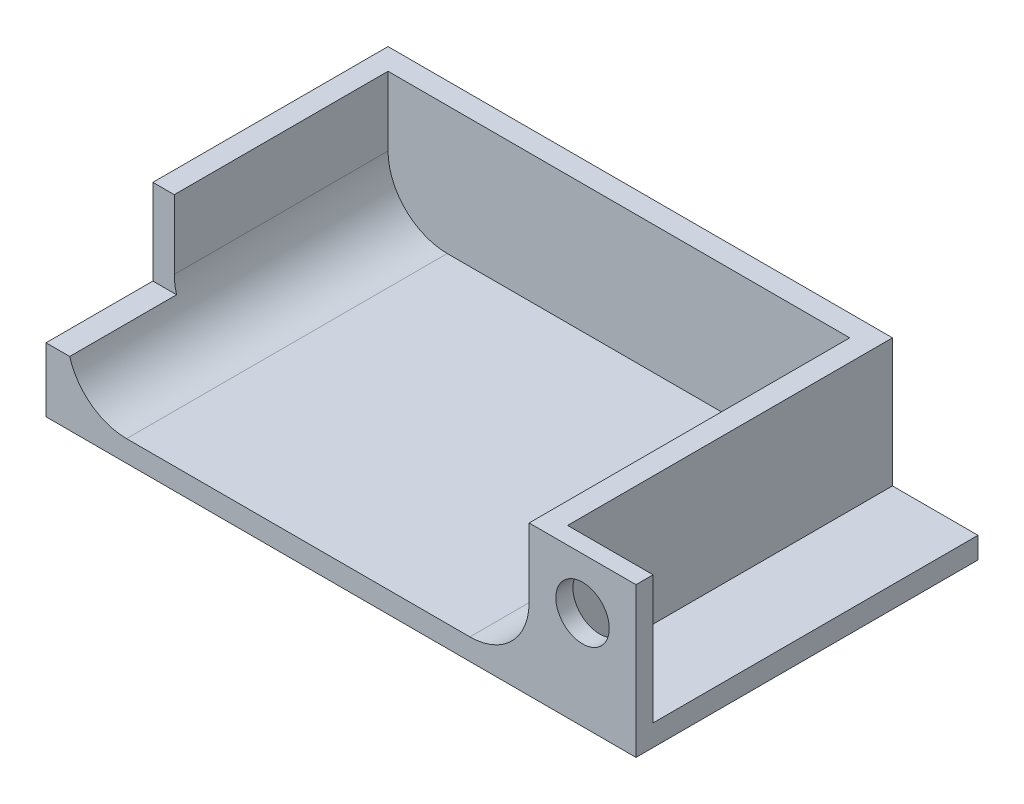
ISO-10303-21;
HEADER;
FILE_DESCRIPTION(('STEP AP214'),'2;1');
FILE_NAME('part.step','',(''),(''),'','','');
FILE_SCHEMA(('AUTOMOTIVE_DESIGN { 1 0 10303 214 1 1 1 1 }'));
ENDSEC;
DATA;
#1=APPLICATION_CONTEXT('core data for automotive mechanical design processes');
#2=APPLICATION_PROTOCOL_DEFINITION('international standard','automotive_design',2000,#1);
#3=PRODUCT_CONTEXT('',#1,'mechanical');
#4=PRODUCT('Part','Part','',(#3));
#5=PRODUCT_RELATED_PRODUCT_CATEGORY('part','',(#4));
#6=PRODUCT_DEFINITION_FORMATION('','',#4);
#7=PRODUCT_DEFINITION_CONTEXT('part definition',#1,'design');
#8=PRODUCT_DEFINITION('design','',#6,#7);
#9=PRODUCT_DEFINITION_SHAPE('','',#8);
#10=(LENGTH_UNIT() NAMED_UNIT(*) SI_UNIT(.MILLI.,.METRE.));
#11=(NAMED_UNIT(*) PLANE_ANGLE_UNIT() SI_UNIT($,.RADIAN.));
#12=(NAMED_UNIT(*) SI_UNIT($,.STERADIAN.) SOLID_ANGLE_UNIT());
#13=UNCERTAINTY_MEASURE_WITH_UNIT(LENGTH_MEASURE(1.E-05),#10,'distance_accuracy_value','');
#14=(GEOMETRIC_REPRESENTATION_CONTEXT(3) GLOBAL_UNCERTAINTY_ASSIGNED_CONTEXT((#13)) GLOBAL_UNIT_ASSIGNED_CONTEXT((#10,
#11,#12)) REPRESENTATION_CONTEXT('',''));
#15=CARTESIAN_POINT('',(0.,0.,0.));
#16=DIRECTION('',(0.,0.,1.));
#17=DIRECTION('',(1.,0.,0.));
#18=AXIS2_PLACEMENT_3D('',#15,#16,#17);
#19=CARTESIAN_POINT('',(0.,5.,0.));
#20=DIRECTION('',(0.,-1.,0.));
#21=DIRECTION('',(0.,0.,-1.));
#22=AXIS2_PLACEMENT_3D('',#19,#20,#21);
#23=PLANE('',#22);
#24=DIRECTION('',(1.,0.,0.));
#25=VECTOR('',#24,1.);
#26=CARTESIAN_POINT('',(0.,5.,0.));
#27=LINE('',#26,#25);
#28=CARTESIAN_POINT('',(18.85,5.,0.));
#29=VERTEX_POINT('',#28);
#30=CARTESIAN_POINT('',(99.15,5.,0.));
#31=VERTEX_POINT('',#30);
#32=EDGE_CURVE('E244',#29,#31,#27,.T.);
#33=ORIENTED_EDGE('',*,*,#32,.T.);
#34=DIRECTION('',(0.,0.,1.));
#35=VECTOR('',#34,1.);
#36=CARTESIAN_POINT('',(99.15,5.,-75.));
#37=LINE('',#36,#35);
#38=CARTESIAN_POINT('',(99.15,5.,-75.));
#39=VERTEX_POINT('',#38);
#40=EDGE_CURVE('E276',#31,#39,#37,.F.);
#41=ORIENTED_EDGE('',*,*,#40,.T.);
#42=DIRECTION('',(-1.,0.,0.));
#43=VECTOR('',#42,1.);
#44=CARTESIAN_POINT('',(0.,5.,-75.));
#45=LINE('',#44,#43);
#46=CARTESIAN_POINT('',(18.85,5.,-75.));
#47=VERTEX_POINT('',#46);
#48=EDGE_CURVE('E248',#39,#47,#45,.T.);
#49=ORIENTED_EDGE('',*,*,#48,.T.);
#50=DIRECTION('',(0.,0.,-1.));
#51=VECTOR('',#50,1.);
#52=CARTESIAN_POINT('',(18.85,5.,0.));
#53=LINE('',#52,#51);
#54=EDGE_CURVE('E273',#47,#29,#53,.F.);
#55=ORIENTED_EDGE('',*,*,#54,.T.);
#56=EDGE_LOOP('',(#33,#41,#49,#55));
#57=FACE_BOUND('',#56,.T.);
#58=ADVANCED_FACE('F38',(#57),#23,.F.);
#59=CARTESIAN_POINT('',(0.,5.,0.));
#60=DIRECTION('',(1.,0.,0.));
#61=DIRECTION('',(0.,0.,-1.));
#62=AXIS2_PLACEMENT_3D('',#59,#60,#61);
#63=PLANE('',#62);
#64=DIRECTION('',(0.,-1.,0.));
#65=VECTOR('',#64,1.);
#66=CARTESIAN_POINT('',(0.,5.,0.));
#67=LINE('',#66,#65);
#68=CARTESIAN_POINT('',(0.,15.,0.));
#69=VERTEX_POINT('',#68);
#70=CARTESIAN_POINT('',(0.,0.,0.));
#71=VERTEX_POINT('',#70);
#72=EDGE_CURVE('E266',#69,#71,#67,.T.);
#73=ORIENTED_EDGE('',*,*,#72,.F.);
#74=DIRECTION('',(0.,0.,1.));
#75=VECTOR('',#74,1.);
#76=CARTESIAN_POINT('',(0.,15.,0.));
#77=LINE('',#76,#75);
#78=CARTESIAN_POINT('',(0.,15.,-25.));
#79=VERTEX_POINT('',#78);
#80=EDGE_CURVE('E181',#79,#69,#77,.T.);
#81=ORIENTED_EDGE('',*,*,#80,.F.);
#82=DIRECTION('',(0.,-1.,0.));
#83=VECTOR('',#82,1.);
#84=CARTESIAN_POINT('',(0.,35.,-25.));
#85=LINE('',#84,#83);
#86=CARTESIAN_POINT('',(0.,35.,-25.));
#87=VERTEX_POINT('',#86);
#88=EDGE_CURVE('E178',#87,#79,#85,.T.);
#89=ORIENTED_EDGE('',*,*,#88,.F.);
#90=DIRECTION('',(0.,0.,1.));
#91=VECTOR('',#90,1.);
#92=CARTESIAN_POINT('',(0.,35.,-75.));
#93=LINE('',#92,#91);
#94=CARTESIAN_POINT('',(0.,35.,-80.));
#95=VERTEX_POINT('',#94);
#96=EDGE_CURVE('E232',#95,#87,#93,.T.);
#97=ORIENTED_EDGE('',*,*,#96,.F.);
#98=DIRECTION('',(0.,1.,0.));
#99=VECTOR('',#98,1.);
#100=CARTESIAN_POINT('',(0.,0.,-80.));
#101=LINE('',#100,#99);
#102=CARTESIAN_POINT('',(0.,0.,-80.));
#103=VERTEX_POINT('',#102);
#104=EDGE_CURVE('E205',#103,#95,#101,.T.);
#105=ORIENTED_EDGE('',*,*,#104,.F.);
#106=DIRECTION('',(0.,0.,1.));
#107=VECTOR('',#106,1.);
#108=CARTESIAN_POINT('',(0.,0.,0.));
#109=LINE('',#108,#107);
#110=EDGE_CURVE('E243',#103,#71,#109,.T.);
#111=ORIENTED_EDGE('',*,*,#110,.T.);
#112=EDGE_LOOP('',(#73,#81,#89,#97,#105,#111));
#113=FACE_BOUND('',#112,.T.);
#114=ADVANCED_FACE('F333',(#113),#63,.F.);
#115=CARTESIAN_POINT('',(0.,5.,0.));
#116=DIRECTION('',(0.,0.,-1.));
#117=DIRECTION('',(-1.,0.,0.));
#118=AXIS2_PLACEMENT_3D('',#115,#116,#117);
#119=PLANE('',#118);
#120=CARTESIAN_POINT('',(125.5,23.,0.));
#121=DIRECTION('',(0.,0.,1.));
#122=DIRECTION('',(1.,0.,0.));
#123=AXIS2_PLACEMENT_3D('',#120,#121,#122);
#124=CIRCLE('',#123,6.25);
#125=CARTESIAN_POINT('',(131.75,23.,0.));
#126=VERTEX_POINT('',#125);
#127=EDGE_CURVE('E460',#126,#126,#124,.T.);
#128=ORIENTED_EDGE('',*,*,#127,.F.);
#129=EDGE_LOOP('',(#128));
#130=FACE_BOUND('',#129,.T.);
#131=CARTESIAN_POINT('',(18.85,18.85,0.));
#132=DIRECTION('',(0.,0.,-1.));
#133=DIRECTION('',(-1.,0.,0.));
#134=AXIS2_PLACEMENT_3D('',#131,#132,#133);
#135=CIRCLE('',#134,13.85);
#136=CARTESIAN_POINT('',(5.54586530434994,15.,0.));
#137=VERTEX_POINT('',#136);
#138=EDGE_CURVE('E292',#29,#137,#135,.T.);
#139=ORIENTED_EDGE('',*,*,#138,.T.);
#140=DIRECTION('',(-1.,0.,0.));
#141=VECTOR('',#140,1.);
#142=CARTESIAN_POINT('',(6.,15.,0.));
#143=LINE('',#142,#141);
#144=EDGE_CURVE('E185',#137,#69,#143,.T.);
#145=ORIENTED_EDGE('',*,*,#144,.T.);
#146=ORIENTED_EDGE('',*,*,#72,.T.);
#147=DIRECTION('',(1.,0.,0.));
#148=VECTOR('',#147,1.);
#149=CARTESIAN_POINT('',(0.,0.,0.));
#150=LINE('',#149,#148);
#151=CARTESIAN_POINT('',(138.,0.,0.));
#152=VERTEX_POINT('',#151);
#153=EDGE_CURVE('E257',#71,#152,#150,.T.);
#154=ORIENTED_EDGE('',*,*,#153,.T.);
#155=DIRECTION('',(0.,-1.,0.));
#156=VECTOR('',#155,1.);
#157=CARTESIAN_POINT('',(138.,5.,0.));
#158=LINE('',#157,#156);
#159=CARTESIAN_POINT('',(138.,35.,0.));
#160=VERTEX_POINT('',#159);
#161=EDGE_CURVE('E253',#160,#152,#158,.T.);
#162=ORIENTED_EDGE('',*,*,#161,.F.);
#163=DIRECTION('',(1.,0.,0.));
#164=VECTOR('',#163,1.);
#165=CARTESIAN_POINT('',(138.,35.,0.));
#166=LINE('',#165,#164);
#167=CARTESIAN_POINT('',(113.,35.,0.));
#168=VERTEX_POINT('',#167);
#169=EDGE_CURVE('E220',#168,#160,#166,.T.);
#170=ORIENTED_EDGE('',*,*,#169,.F.);
#171=DIRECTION('',(0.,-1.,0.));
#172=VECTOR('',#171,1.);
#173=CARTESIAN_POINT('',(113.,35.,0.));
#174=LINE('',#173,#172);
#175=CARTESIAN_POINT('',(113.,18.85,0.));
#176=VERTEX_POINT('',#175);
#177=EDGE_CURVE('E224',#168,#176,#174,.T.);
#178=ORIENTED_EDGE('',*,*,#177,.T.);
#179=CARTESIAN_POINT('',(99.15,18.85,0.));
#180=DIRECTION('',(0.,0.,-1.));
#181=DIRECTION('',(-1.,0.,0.));
#182=AXIS2_PLACEMENT_3D('',#179,#180,#181);
#183=CIRCLE('',#182,13.85);
#184=EDGE_CURVE('E283',#176,#31,#183,.T.);
#185=ORIENTED_EDGE('',*,*,#184,.T.);
#186=ORIENTED_EDGE('',*,*,#32,.F.);
#187=EDGE_LOOP('',(#139,#145,#146,#154,#162,#170,#178,#185,#186));
#188=FACE_BOUND('',#187,.T.);
#189=ADVANCED_FACE('F324',(#130,#188),#119,.F.);
#190=CARTESIAN_POINT('',(138.,5.,0.));
#191=DIRECTION('',(-1.,0.,0.));
#192=DIRECTION('',(0.,0.,1.));
#193=AXIS2_PLACEMENT_3D('',#190,#191,#192);
#194=PLANE('',#193);
#195=DIRECTION('',(0.,0.,-1.));
#196=VECTOR('',#195,1.);
#197=CARTESIAN_POINT('',(138.,5.,-80.));
#198=LINE('',#197,#196);
#199=CARTESIAN_POINT('',(138.,5.,-4.));
#200=VERTEX_POINT('',#199);
#201=CARTESIAN_POINT('',(138.,5.,-80.));
#202=VERTEX_POINT('',#201);
#203=EDGE_CURVE('E54',#200,#202,#198,.T.);
#204=ORIENTED_EDGE('',*,*,#203,.F.);
#205=DIRECTION('',(0.,1.,0.));
#206=VECTOR('',#205,1.);
#207=CARTESIAN_POINT('',(138.,5.,-4.));
#208=LINE('',#207,#206);
#209=CARTESIAN_POINT('',(138.,35.,-4.));
#210=VERTEX_POINT('',#209);
#211=EDGE_CURVE('E173',#200,#210,#208,.T.);
#212=ORIENTED_EDGE('',*,*,#211,.T.);
#213=DIRECTION('',(0.,0.,-1.));
#214=VECTOR('',#213,1.);
#215=CARTESIAN_POINT('',(138.,35.,-75.));
#216=LINE('',#215,#214);
#217=EDGE_CURVE('E210',#160,#210,#216,.T.);
#218=ORIENTED_EDGE('',*,*,#217,.F.);
#219=ORIENTED_EDGE('',*,*,#161,.T.);
#220=DIRECTION('',(0.,0.,-1.));
#221=VECTOR('',#220,1.);
#222=CARTESIAN_POINT('',(138.,0.,0.));
#223=LINE('',#222,#221);
#224=CARTESIAN_POINT('',(138.,0.,-80.));
#225=VERTEX_POINT('',#224);
#226=EDGE_CURVE('E249',#152,#225,#223,.T.);
#227=ORIENTED_EDGE('',*,*,#226,.T.);
#228=DIRECTION('',(0.,-1.,0.));
#229=VECTOR('',#228,1.);
#230=CARTESIAN_POINT('',(138.,0.,-80.));
#231=LINE('',#230,#229);
#232=EDGE_CURVE('E198',#202,#225,#231,.T.);
#233=ORIENTED_EDGE('',*,*,#232,.F.);
#234=EDGE_LOOP('',(#204,#212,#218,#219,#227,#233));
#235=FACE_BOUND('',#234,.T.);
#236=ADVANCED_FACE('F341',(#235),#194,.F.);
#237=CARTESIAN_POINT('',(0.,0.,0.));
#238=DIRECTION('',(0.,-1.,0.));
#239=DIRECTION('',(0.,0.,-1.));
#240=AXIS2_PLACEMENT_3D('',#237,#238,#239);
#241=PLANE('',#240);
#242=ORIENTED_EDGE('',*,*,#110,.F.);
#243=DIRECTION('',(-1.,0.,0.));
#244=VECTOR('',#243,1.);
#245=CARTESIAN_POINT('',(138.,0.,-80.));
#246=LINE('',#245,#244);
#247=EDGE_CURVE('E201',#225,#103,#246,.T.);
#248=ORIENTED_EDGE('',*,*,#247,.F.);
#249=ORIENTED_EDGE('',*,*,#226,.F.);
#250=ORIENTED_EDGE('',*,*,#153,.F.);
#251=EDGE_LOOP('',(#242,#248,#249,#250));
#252=FACE_BOUND('',#251,.T.);
#253=ADVANCED_FACE('F338',(#252),#241,.T.);
#254=CARTESIAN_POINT('',(5.,35.,-75.));
#255=DIRECTION('',(-1.,0.,0.));
#256=DIRECTION('',(0.,0.,1.));
#257=AXIS2_PLACEMENT_3D('',#254,#255,#256);
#258=PLANE('',#257);
#259=DIRECTION('',(0.,0.,-1.));
#260=VECTOR('',#259,1.);
#261=CARTESIAN_POINT('',(5.,35.,-75.));
#262=LINE('',#261,#260);
#263=CARTESIAN_POINT('',(5.00000000000001,35.,-25.));
#264=VERTEX_POINT('',#263);
#265=CARTESIAN_POINT('',(5.,35.,-75.));
#266=VERTEX_POINT('',#265);
#267=EDGE_CURVE('E236',#264,#266,#262,.T.);
#268=ORIENTED_EDGE('',*,*,#267,.F.);
#269=DIRECTION('',(0.,-1.,0.));
#270=VECTOR('',#269,1.);
#271=CARTESIAN_POINT('',(5.00000000000001,35.,-25.));
#272=LINE('',#271,#270);
#273=CARTESIAN_POINT('',(5.,18.85,-25.));
#274=VERTEX_POINT('',#273);
#275=EDGE_CURVE('E189',#264,#274,#272,.T.);
#276=ORIENTED_EDGE('',*,*,#275,.T.);
#277=DIRECTION('',(0.,0.,-1.));
#278=VECTOR('',#277,1.);
#279=CARTESIAN_POINT('',(5.,18.85,-75.));
#280=LINE('',#279,#278);
#281=CARTESIAN_POINT('',(5.,18.85,-75.));
#282=VERTEX_POINT('',#281);
#283=EDGE_CURVE('E280',#274,#282,#280,.T.);
#284=ORIENTED_EDGE('',*,*,#283,.T.);
#285=DIRECTION('',(0.,-1.,0.));
#286=VECTOR('',#285,1.);
#287=CARTESIAN_POINT('',(5.,35.,-75.));
#288=LINE('',#287,#286);
#289=EDGE_CURVE('E239',#266,#282,#288,.T.);
#290=ORIENTED_EDGE('',*,*,#289,.F.);
#291=EDGE_LOOP('',(#268,#276,#284,#290));
#292=FACE_BOUND('',#291,.T.);
#293=ADVANCED_FACE('F305',(#292),#258,.F.);
#294=CARTESIAN_POINT('',(0.,35.,0.));
#295=DIRECTION('',(0.,1.,0.));
#296=DIRECTION('',(0.,0.,1.));
#297=AXIS2_PLACEMENT_3D('',#294,#295,#296);
#298=PLANE('',#297);
#299=DIRECTION('',(1.,0.,0.));
#300=VECTOR('',#299,1.);
#301=CARTESIAN_POINT('',(138.,35.,-4.));
#302=LINE('',#301,#300);
#303=CARTESIAN_POINT('',(118.,35.,-4.));
#304=VERTEX_POINT('',#303);
#305=EDGE_CURVE('E344',#304,#210,#302,.T.);
#306=ORIENTED_EDGE('',*,*,#305,.F.);
#307=DIRECTION('',(0.,0.,1.));
#308=VECTOR('',#307,1.);
#309=CARTESIAN_POINT('',(118.,35.,-80.));
#310=LINE('',#309,#308);
#311=CARTESIAN_POINT('',(118.,35.,-80.));
#312=VERTEX_POINT('',#311);
#313=EDGE_CURVE('E345',#312,#304,#310,.T.);
#314=ORIENTED_EDGE('',*,*,#313,.F.);
#315=DIRECTION('',(1.,0.,0.));
#316=VECTOR('',#315,1.);
#317=CARTESIAN_POINT('',(138.,35.,-80.));
#318=LINE('',#317,#316);
#319=EDGE_CURVE('E168',#95,#312,#318,.T.);
#320=ORIENTED_EDGE('',*,*,#319,.F.);
#321=ORIENTED_EDGE('',*,*,#96,.T.);
#322=DIRECTION('',(-1.,0.,0.));
#323=VECTOR('',#322,1.);
#324=CARTESIAN_POINT('',(6.,35.,-25.));
#325=LINE('',#324,#323);
#326=EDGE_CURVE('E184',#264,#87,#325,.T.);
#327=ORIENTED_EDGE('',*,*,#326,.F.);
#328=ORIENTED_EDGE('',*,*,#267,.T.);
#329=DIRECTION('',(1.,0.,0.));
#330=VECTOR('',#329,1.);
#331=CARTESIAN_POINT('',(138.,35.,-75.));
#332=LINE('',#331,#330);
#333=CARTESIAN_POINT('',(113.,35.,-75.));
#334=VERTEX_POINT('',#333);
#335=EDGE_CURVE('E197',#266,#334,#332,.T.);
#336=ORIENTED_EDGE('',*,*,#335,.T.);
#337=DIRECTION('',(0.,0.,1.));
#338=VECTOR('',#337,1.);
#339=CARTESIAN_POINT('',(113.,35.,-75.));
#340=LINE('',#339,#338);
#341=EDGE_CURVE('E217',#334,#168,#340,.T.);
#342=ORIENTED_EDGE('',*,*,#341,.T.);
#343=ORIENTED_EDGE('',*,*,#169,.T.);
#344=ORIENTED_EDGE('',*,*,#217,.T.);
#345=EDGE_LOOP('',(#306,#314,#320,#321,#327,#328,#336,#342,#343,#344));
#346=FACE_BOUND('',#345,.T.);
#347=ADVANCED_FACE('F310',(#346),#298,.T.);
#348=CARTESIAN_POINT('',(113.,35.,-75.));
#349=DIRECTION('',(1.,0.,0.));
#350=DIRECTION('',(0.,0.,-1.));
#351=AXIS2_PLACEMENT_3D('',#348,#349,#350);
#352=PLANE('',#351);
#353=DIRECTION('',(0.,-1.,0.));
#354=VECTOR('',#353,1.);
#355=CARTESIAN_POINT('',(113.,35.,-75.));
#356=LINE('',#355,#354);
#357=CARTESIAN_POINT('',(113.,18.85,-75.));
#358=VERTEX_POINT('',#357);
#359=EDGE_CURVE('E228',#334,#358,#356,.T.);
#360=ORIENTED_EDGE('',*,*,#359,.T.);
#361=DIRECTION('',(0.,0.,1.));
#362=VECTOR('',#361,1.);
#363=CARTESIAN_POINT('',(113.,18.85,0.));
#364=LINE('',#363,#362);
#365=EDGE_CURVE('E269',#358,#176,#364,.T.);
#366=ORIENTED_EDGE('',*,*,#365,.T.);
#367=ORIENTED_EDGE('',*,*,#177,.F.);
#368=ORIENTED_EDGE('',*,*,#341,.F.);
#369=EDGE_LOOP('',(#360,#366,#367,#368));
#370=FACE_BOUND('',#369,.T.);
#371=ADVANCED_FACE('F317',(#370),#352,.F.);
#372=CARTESIAN_POINT('',(99.15,18.85,-75.));
#373=DIRECTION('',(0.,0.,-1.));
#374=DIRECTION('',(-1.,0.,0.));
#375=AXIS2_PLACEMENT_3D('',#372,#373,#374);
#376=CYLINDRICAL_SURFACE('',#375,13.85);
#377=CARTESIAN_POINT('',(99.15,18.85,-75.));
#378=DIRECTION('',(0.,0.,1.));
#379=DIRECTION('',(1.,0.,0.));
#380=AXIS2_PLACEMENT_3D('',#377,#378,#379);
#381=CIRCLE('',#380,13.85);
#382=EDGE_CURVE('E286',#39,#358,#381,.T.);
#383=ORIENTED_EDGE('',*,*,#382,.F.);
#384=ORIENTED_EDGE('',*,*,#40,.F.);
#385=ORIENTED_EDGE('',*,*,#184,.F.);
#386=ORIENTED_EDGE('',*,*,#365,.F.);
#387=EDGE_LOOP('',(#383,#384,#385,#386));
#388=FACE_BOUND('',#387,.T.);
#389=ADVANCED_FACE('F320',(#388),#376,.F.);
#390=CARTESIAN_POINT('',(18.85,18.85,-75.));
#391=DIRECTION('',(0.,0.,1.));
#392=DIRECTION('',(1.,0.,0.));
#393=AXIS2_PLACEMENT_3D('',#390,#391,#392);
#394=CYLINDRICAL_SURFACE('',#393,13.85);
#395=CARTESIAN_POINT('',(18.85,18.85,-25.));
#396=DIRECTION('',(0.,0.,-1.));
#397=DIRECTION('',(0.,1.,0.));
#398=AXIS2_PLACEMENT_3D('',#395,#396,#397);
#399=CIRCLE('',#398,13.85);
#400=CARTESIAN_POINT('',(5.54586530434994,15.,-25.));
#401=VERTEX_POINT('',#400);
#402=EDGE_CURVE('E47',#274,#401,#399,.F.);
#403=ORIENTED_EDGE('',*,*,#402,.T.);
#404=DIRECTION('',(0.,0.,1.));
#405=VECTOR('',#404,1.);
#406=CARTESIAN_POINT('',(5.54586530434993,15.,-75.));
#407=LINE('',#406,#405);
#408=EDGE_CURVE('E11',#401,#137,#407,.T.);
#409=ORIENTED_EDGE('',*,*,#408,.T.);
#410=ORIENTED_EDGE('',*,*,#138,.F.);
#411=ORIENTED_EDGE('',*,*,#54,.F.);
#412=CARTESIAN_POINT('',(18.85,18.85,-75.));
#413=DIRECTION('',(0.,0.,1.));
#414=DIRECTION('',(1.,0.,0.));
#415=AXIS2_PLACEMENT_3D('',#412,#413,#414);
#416=CIRCLE('',#415,13.85);
#417=EDGE_CURVE('E289',#282,#47,#416,.T.);
#418=ORIENTED_EDGE('',*,*,#417,.F.);
#419=ORIENTED_EDGE('',*,*,#283,.F.);
#420=EDGE_LOOP('',(#403,#409,#410,#411,#418,#419));
#421=FACE_BOUND('',#420,.T.);
#422=ADVANCED_FACE('F40',(#421),#394,.F.);
#423=CARTESIAN_POINT('',(0.,0.,-80.));
#424=DIRECTION('',(0.,0.,1.));
#425=DIRECTION('',(1.,0.,0.));
#426=AXIS2_PLACEMENT_3D('',#423,#424,#425);
#427=PLANE('',#426);
#428=ORIENTED_EDGE('',*,*,#319,.T.);
#429=DIRECTION('',(0.,1.,0.));
#430=VECTOR('',#429,1.);
#431=CARTESIAN_POINT('',(118.,5.,-80.));
#432=LINE('',#431,#430);
#433=CARTESIAN_POINT('',(118.,5.,-80.));
#434=VERTEX_POINT('',#433);
#435=EDGE_CURVE('E151',#434,#312,#432,.T.);
#436=ORIENTED_EDGE('',*,*,#435,.F.);
#437=DIRECTION('',(-1.,0.,0.));
#438=VECTOR('',#437,1.);
#439=CARTESIAN_POINT('',(138.,5.,-80.));
#440=LINE('',#439,#438);
#441=EDGE_CURVE('E157',#202,#434,#440,.T.);
#442=ORIENTED_EDGE('',*,*,#441,.F.);
#443=ORIENTED_EDGE('',*,*,#232,.T.);
#444=ORIENTED_EDGE('',*,*,#247,.T.);
#445=ORIENTED_EDGE('',*,*,#104,.T.);
#446=EDGE_LOOP('',(#428,#436,#442,#443,#444,#445));
#447=FACE_BOUND('',#446,.T.);
#448=ADVANCED_FACE('F165',(#447),#427,.F.);
#449=CARTESIAN_POINT('',(0.,0.,-75.));
#450=DIRECTION('',(0.,0.,1.));
#451=DIRECTION('',(1.,0.,0.));
#452=AXIS2_PLACEMENT_3D('',#449,#450,#451);
#453=PLANE('',#452);
#454=ORIENTED_EDGE('',*,*,#335,.F.);
#455=ORIENTED_EDGE('',*,*,#289,.T.);
#456=ORIENTED_EDGE('',*,*,#417,.T.);
#457=ORIENTED_EDGE('',*,*,#48,.F.);
#458=ORIENTED_EDGE('',*,*,#382,.T.);
#459=ORIENTED_EDGE('',*,*,#359,.F.);
#460=EDGE_LOOP('',(#454,#455,#456,#457,#458,#459));
#461=FACE_BOUND('',#460,.T.);
#462=ADVANCED_FACE('F313',(#461),#453,.T.);
#463=CARTESIAN_POINT('',(6.,15.,0.));
#464=DIRECTION('',(0.,-1.,0.));
#465=DIRECTION('',(0.,0.,-1.));
#466=AXIS2_PLACEMENT_3D('',#463,#464,#465);
#467=PLANE('',#466);
#468=DIRECTION('',(-1.,0.,0.));
#469=VECTOR('',#468,1.);
#470=CARTESIAN_POINT('',(6.,15.,-25.));
#471=LINE('',#470,#469);
#472=EDGE_CURVE('E62',#401,#79,#471,.T.);
#473=ORIENTED_EDGE('',*,*,#472,.T.);
#474=ORIENTED_EDGE('',*,*,#80,.T.);
#475=ORIENTED_EDGE('',*,*,#144,.F.);
#476=ORIENTED_EDGE('',*,*,#408,.F.);
#477=EDGE_LOOP('',(#473,#474,#475,#476));
#478=FACE_BOUND('',#477,.T.);
#479=ADVANCED_FACE('F364',(#478),#467,.F.);
#480=CARTESIAN_POINT('',(6.,35.,-25.));
#481=DIRECTION('',(0.,0.,-1.));
#482=DIRECTION('',(0.,1.,0.));
#483=AXIS2_PLACEMENT_3D('',#480,#481,#482);
#484=PLANE('',#483);
#485=ORIENTED_EDGE('',*,*,#326,.T.);
#486=ORIENTED_EDGE('',*,*,#88,.T.);
#487=ORIENTED_EDGE('',*,*,#472,.F.);
#488=ORIENTED_EDGE('',*,*,#402,.F.);
#489=ORIENTED_EDGE('',*,*,#275,.F.);
#490=EDGE_LOOP('',(#485,#486,#487,#488,#489));
#491=FACE_BOUND('',#490,.T.);
#492=ADVANCED_FACE('F301',(#491),#484,.F.);
#493=CARTESIAN_POINT('',(138.,5.,-4.));
#494=DIRECTION('',(0.,0.,1.));
#495=DIRECTION('',(1.,0.,0.));
#496=AXIS2_PLACEMENT_3D('',#493,#494,#495);
#497=PLANE('',#496);
#498=CARTESIAN_POINT('',(125.5,23.,-4.));
#499=DIRECTION('',(0.,0.,1.));
#500=DIRECTION('',(1.,0.,0.));
#501=AXIS2_PLACEMENT_3D('',#498,#499,#500);
#502=CIRCLE('',#501,6.25);
#503=CARTESIAN_POINT('',(131.75,23.,-4.));
#504=VERTEX_POINT('',#503);
#505=EDGE_CURVE('E352',#504,#504,#502,.F.);
#506=ORIENTED_EDGE('',*,*,#505,.F.);
#507=EDGE_LOOP('',(#506));
#508=FACE_BOUND('',#507,.T.);
#509=ORIENTED_EDGE('',*,*,#305,.T.);
#510=ORIENTED_EDGE('',*,*,#211,.F.);
#511=DIRECTION('',(1.,0.,0.));
#512=VECTOR('',#511,1.);
#513=CARTESIAN_POINT('',(138.,5.,-4.));
#514=LINE('',#513,#512);
#515=CARTESIAN_POINT('',(118.,5.,-4.));
#516=VERTEX_POINT('',#515);
#517=EDGE_CURVE('E156',#516,#200,#514,.T.);
#518=ORIENTED_EDGE('',*,*,#517,.F.);
#519=DIRECTION('',(0.,1.,0.));
#520=VECTOR('',#519,1.);
#521=CARTESIAN_POINT('',(118.,5.,-4.));
#522=LINE('',#521,#520);
#523=EDGE_CURVE('E153',#516,#304,#522,.T.);
#524=ORIENTED_EDGE('',*,*,#523,.T.);
#525=EDGE_LOOP('',(#509,#510,#518,#524));
#526=FACE_BOUND('',#525,.T.);
#527=ADVANCED_FACE('F355',(#508,#526),#497,.F.);
#528=CARTESIAN_POINT('',(118.,5.,-80.));
#529=DIRECTION('',(-1.,0.,0.));
#530=DIRECTION('',(0.,0.,1.));
#531=AXIS2_PLACEMENT_3D('',#528,#529,#530);
#532=PLANE('',#531);
#533=ORIENTED_EDGE('',*,*,#313,.T.);
#534=ORIENTED_EDGE('',*,*,#523,.F.);
#535=DIRECTION('',(0.,0.,1.));
#536=VECTOR('',#535,1.);
#537=CARTESIAN_POINT('',(118.,5.,-80.));
#538=LINE('',#537,#536);
#539=EDGE_CURVE('E147',#434,#516,#538,.T.);
#540=ORIENTED_EDGE('',*,*,#539,.F.);
#541=ORIENTED_EDGE('',*,*,#435,.T.);
#542=EDGE_LOOP('',(#533,#534,#540,#541));
#543=FACE_BOUND('',#542,.T.);
#544=ADVANCED_FACE('F149',(#543),#532,.F.);
#545=CARTESIAN_POINT('',(0.,5.,0.));
#546=DIRECTION('',(0.,-1.,0.));
#547=DIRECTION('',(0.,0.,-1.));
#548=AXIS2_PLACEMENT_3D('',#545,#546,#547);
#549=PLANE('',#548);
#550=ORIENTED_EDGE('',*,*,#203,.T.);
#551=ORIENTED_EDGE('',*,*,#441,.T.);
#552=ORIENTED_EDGE('',*,*,#539,.T.);
#553=ORIENTED_EDGE('',*,*,#517,.T.);
#554=EDGE_LOOP('',(#550,#551,#552,#553));
#555=FACE_BOUND('',#554,.T.);
#556=ADVANCED_FACE('F159',(#555),#549,.F.);
#557=CARTESIAN_POINT('',(125.5,23.,-21.6776695296637));
#558=DIRECTION('',(0.,0.,1.));
#559=DIRECTION('',(1.,0.,0.));
#560=AXIS2_PLACEMENT_3D('',#557,#558,#559);
#561=CYLINDRICAL_SURFACE('',#560,6.25);
#562=ORIENTED_EDGE('',*,*,#505,.T.);
#563=EDGE_LOOP('',(#562));
#564=FACE_BOUND('',#563,.T.);
#565=ORIENTED_EDGE('',*,*,#127,.T.);
#566=EDGE_LOOP('',(#565));
#567=FACE_BOUND('',#566,.T.);
#568=ADVANCED_FACE('F437',(#564,#567),#561,.F.);
#569=CLOSED_SHELL('',(#58,#114,#189,#236,#253,#293,#347,#371,#389,#422,#448,#462,#479,#492,#527,
#544,#556,#568));
#570=MANIFOLD_SOLID_BREP('B2',#569);
#571=ADVANCED_BREP_SHAPE_REPRESENTATION('',(#18,#570),#14);
#572=SHAPE_DEFINITION_REPRESENTATION(#9,#571);
ENDSEC;
END-ISO-10303-21;
